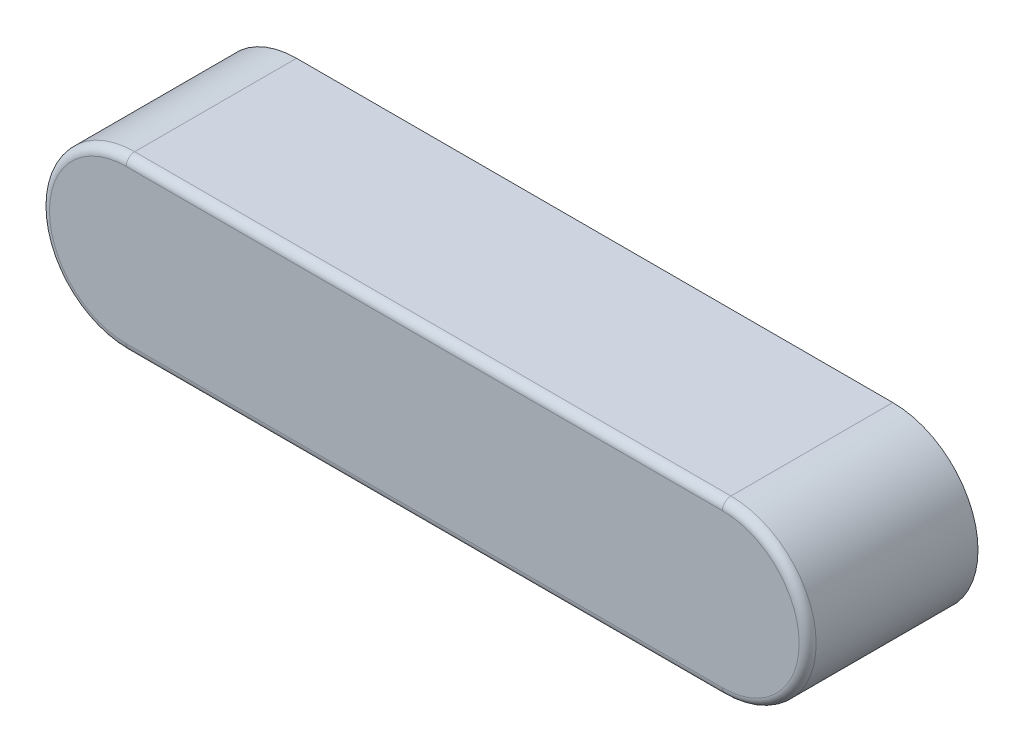
ISO-10303-21;
HEADER;
FILE_DESCRIPTION(('STEP AP214'),'2;1');
FILE_NAME('part.step','',(''),(''),'','','');
FILE_SCHEMA(('AUTOMOTIVE_DESIGN { 1 0 10303 214 1 1 1 1 }'));
ENDSEC;
DATA;
#1=APPLICATION_CONTEXT('core data for automotive mechanical design processes');
#2=APPLICATION_PROTOCOL_DEFINITION('international standard','automotive_design',2000,#1);
#3=PRODUCT_CONTEXT('',#1,'mechanical');
#4=PRODUCT('Part','Part','',(#3));
#5=PRODUCT_RELATED_PRODUCT_CATEGORY('part','',(#4));
#6=PRODUCT_DEFINITION_FORMATION('','',#4);
#7=PRODUCT_DEFINITION_CONTEXT('part definition',#1,'design');
#8=PRODUCT_DEFINITION('design','',#6,#7);
#9=PRODUCT_DEFINITION_SHAPE('','',#8);
#10=(LENGTH_UNIT() NAMED_UNIT(*) SI_UNIT(.MILLI.,.METRE.));
#11=(NAMED_UNIT(*) PLANE_ANGLE_UNIT() SI_UNIT($,.RADIAN.));
#12=(NAMED_UNIT(*) SI_UNIT($,.STERADIAN.) SOLID_ANGLE_UNIT());
#13=UNCERTAINTY_MEASURE_WITH_UNIT(LENGTH_MEASURE(1.E-05),#10,'distance_accuracy_value','');
#14=(GEOMETRIC_REPRESENTATION_CONTEXT(3) GLOBAL_UNCERTAINTY_ASSIGNED_CONTEXT((#13)) GLOBAL_UNIT_ASSIGNED_CONTEXT((#10,
#11,#12)) REPRESENTATION_CONTEXT('',''));
#15=CARTESIAN_POINT('',(0.,0.,0.));
#16=DIRECTION('',(0.,0.,1.));
#17=DIRECTION('',(1.,0.,0.));
#18=AXIS2_PLACEMENT_3D('',#15,#16,#17);
#19=CARTESIAN_POINT('',(-4.81757877280265,1.29059008723816,2.));
#20=DIRECTION('',(0.,0.,-1.));
#21=DIRECTION('',(-1.,0.,0.));
#22=AXIS2_PLACEMENT_3D('',#19,#20,#21);
#23=CYLINDRICAL_SURFACE('',#22,1.);
#24=DIRECTION('',(0.,0.,-1.));
#25=VECTOR('',#24,1.);
#26=CARTESIAN_POINT('',(-4.81757877280265,0.290590087238164,2.));
#27=LINE('',#26,#25);
#28=CARTESIAN_POINT('',(-4.81757877280265,0.290590087238164,1.9));
#29=VERTEX_POINT('',#28);
#30=CARTESIAN_POINT('',(-4.81757877280265,0.290590087238164,0.));
#31=VERTEX_POINT('',#30);
#32=EDGE_CURVE('E95',#29,#31,#27,.T.);
#33=ORIENTED_EDGE('',*,*,#32,.F.);
#34=CARTESIAN_POINT('',(-4.81757877280265,1.29059008723816,1.9));
#35=DIRECTION('',(0.,0.,1.));
#36=DIRECTION('',(1.,0.,0.));
#37=AXIS2_PLACEMENT_3D('',#34,#35,#36);
#38=CIRCLE('',#37,1.);
#39=CARTESIAN_POINT('',(-4.81757877280265,2.29059008723816,1.9));
#40=VERTEX_POINT('',#39);
#41=EDGE_CURVE('E11',#29,#40,#38,.F.);
#42=ORIENTED_EDGE('',*,*,#41,.T.);
#43=DIRECTION('',(0.,0.,-1.));
#44=VECTOR('',#43,1.);
#45=CARTESIAN_POINT('',(-4.81757877280265,2.29059008723816,2.));
#46=LINE('',#45,#44);
#47=CARTESIAN_POINT('',(-4.81757877280265,2.29059008723816,0.));
#48=VERTEX_POINT('',#47);
#49=EDGE_CURVE('E117',#40,#48,#46,.T.);
#50=ORIENTED_EDGE('',*,*,#49,.T.);
#51=CARTESIAN_POINT('',(-4.81757877280265,1.29059008723816,0.));
#52=DIRECTION('',(0.,0.,1.));
#53=DIRECTION('',(1.,0.,0.));
#54=AXIS2_PLACEMENT_3D('',#51,#52,#53);
#55=CIRCLE('',#54,1.);
#56=EDGE_CURVE('E111',#48,#31,#55,.T.);
#57=ORIENTED_EDGE('',*,*,#56,.T.);
#58=EDGE_LOOP('',(#33,#42,#50,#57));
#59=FACE_BOUND('',#58,.T.);
#60=ADVANCED_FACE('F42',(#59),#23,.T.);
#61=CARTESIAN_POINT('',(-4.81757877280265,0.290590087238164,2.));
#62=DIRECTION('',(0.,1.,0.));
#63=DIRECTION('',(0.,0.,1.));
#64=AXIS2_PLACEMENT_3D('',#61,#62,#63);
#65=PLANE('',#64);
#66=DIRECTION('',(0.,0.,-1.));
#67=VECTOR('',#66,1.);
#68=CARTESIAN_POINT('',(2.18242122719735,0.290590087238164,2.));
#69=LINE('',#68,#67);
#70=CARTESIAN_POINT('',(2.18242122719735,0.290590087238164,1.9));
#71=VERTEX_POINT('',#70);
#72=CARTESIAN_POINT('',(2.18242122719735,0.290590087238164,0.));
#73=VERTEX_POINT('',#72);
#74=EDGE_CURVE('E105',#71,#73,#69,.T.);
#75=ORIENTED_EDGE('',*,*,#74,.F.);
#76=DIRECTION('',(1.,0.,0.));
#77=VECTOR('',#76,1.);
#78=CARTESIAN_POINT('',(-4.81757877280265,0.290590087238164,1.9));
#79=LINE('',#78,#77);
#80=EDGE_CURVE('E52',#71,#29,#79,.F.);
#81=ORIENTED_EDGE('',*,*,#80,.T.);
#82=ORIENTED_EDGE('',*,*,#32,.T.);
#83=DIRECTION('',(1.,0.,0.));
#84=VECTOR('',#83,1.);
#85=CARTESIAN_POINT('',(-4.81757877280265,0.290590087238164,0.));
#86=LINE('',#85,#84);
#87=EDGE_CURVE('E98',#31,#73,#86,.T.);
#88=ORIENTED_EDGE('',*,*,#87,.T.);
#89=EDGE_LOOP('',(#75,#81,#82,#88));
#90=FACE_BOUND('',#89,.T.);
#91=ADVANCED_FACE('F97',(#90),#65,.F.);
#92=CARTESIAN_POINT('',(2.18242122719735,1.29059008723816,2.));
#93=DIRECTION('',(0.,0.,-1.));
#94=DIRECTION('',(-1.,0.,0.));
#95=AXIS2_PLACEMENT_3D('',#92,#93,#94);
#96=CYLINDRICAL_SURFACE('',#95,1.);
#97=DIRECTION('',(0.,0.,-1.));
#98=VECTOR('',#97,1.);
#99=CARTESIAN_POINT('',(2.18242122719735,2.29059008723816,2.));
#100=LINE('',#99,#98);
#101=CARTESIAN_POINT('',(2.18242122719735,2.29059008723816,1.9));
#102=VERTEX_POINT('',#101);
#103=CARTESIAN_POINT('',(2.18242122719735,2.29059008723816,0.));
#104=VERTEX_POINT('',#103);
#105=EDGE_CURVE('E132',#102,#104,#100,.T.);
#106=ORIENTED_EDGE('',*,*,#105,.F.);
#107=CARTESIAN_POINT('',(2.18242122719735,1.29059008723816,1.9));
#108=DIRECTION('',(0.,0.,1.));
#109=DIRECTION('',(1.,0.,0.));
#110=AXIS2_PLACEMENT_3D('',#107,#108,#109);
#111=CIRCLE('',#110,1.);
#112=EDGE_CURVE('E67',#102,#71,#111,.F.);
#113=ORIENTED_EDGE('',*,*,#112,.T.);
#114=ORIENTED_EDGE('',*,*,#74,.T.);
#115=CARTESIAN_POINT('',(2.18242122719735,1.29059008723816,0.));
#116=DIRECTION('',(0.,0.,1.));
#117=DIRECTION('',(1.,0.,0.));
#118=AXIS2_PLACEMENT_3D('',#115,#116,#117);
#119=CIRCLE('',#118,1.);
#120=EDGE_CURVE('E113',#73,#104,#119,.T.);
#121=ORIENTED_EDGE('',*,*,#120,.T.);
#122=EDGE_LOOP('',(#106,#113,#114,#121));
#123=FACE_BOUND('',#122,.T.);
#124=ADVANCED_FACE('F182',(#123),#96,.T.);
#125=CARTESIAN_POINT('',(-4.81757877280265,2.29059008723816,2.));
#126=DIRECTION('',(0.,-1.,0.));
#127=DIRECTION('',(0.,0.,-1.));
#128=AXIS2_PLACEMENT_3D('',#125,#126,#127);
#129=PLANE('',#128);
#130=ORIENTED_EDGE('',*,*,#49,.F.);
#131=DIRECTION('',(-1.,0.,0.));
#132=VECTOR('',#131,1.);
#133=CARTESIAN_POINT('',(2.18242122719735,2.29059008723816,1.9));
#134=LINE('',#133,#132);
#135=EDGE_CURVE('E149',#40,#102,#134,.F.);
#136=ORIENTED_EDGE('',*,*,#135,.T.);
#137=ORIENTED_EDGE('',*,*,#105,.T.);
#138=DIRECTION('',(-1.,0.,0.));
#139=VECTOR('',#138,1.);
#140=CARTESIAN_POINT('',(-4.81757877280265,2.29059008723816,0.));
#141=LINE('',#140,#139);
#142=EDGE_CURVE('E127',#104,#48,#141,.T.);
#143=ORIENTED_EDGE('',*,*,#142,.T.);
#144=EDGE_LOOP('',(#130,#136,#137,#143));
#145=FACE_BOUND('',#144,.T.);
#146=ADVANCED_FACE('F181',(#145),#129,.F.);
#147=CARTESIAN_POINT('',(-4.81757877280265,1.29059008723816,2.));
#148=DIRECTION('',(0.,0.,1.));
#149=DIRECTION('',(1.,0.,0.));
#150=AXIS2_PLACEMENT_3D('',#147,#148,#149);
#151=PLANE('',#150);
#152=CARTESIAN_POINT('',(2.18242122719735,1.29059008723816,2.));
#153=DIRECTION('',(0.,0.,1.));
#154=DIRECTION('',(1.,0.,0.));
#155=AXIS2_PLACEMENT_3D('',#152,#153,#154);
#156=CIRCLE('',#155,0.9);
#157=CARTESIAN_POINT('',(2.18242122719735,0.390590087238164,2.));
#158=VERTEX_POINT('',#157);
#159=CARTESIAN_POINT('',(2.18242122719735,2.19059008723816,2.));
#160=VERTEX_POINT('',#159);
#161=EDGE_CURVE('E142',#158,#160,#156,.T.);
#162=ORIENTED_EDGE('',*,*,#161,.T.);
#163=DIRECTION('',(-1.,0.,0.));
#164=VECTOR('',#163,1.);
#165=CARTESIAN_POINT('',(-4.81757877280265,2.19059008723816,2.));
#166=LINE('',#165,#164);
#167=CARTESIAN_POINT('',(-4.81757877280265,2.19059008723816,2.));
#168=VERTEX_POINT('',#167);
#169=EDGE_CURVE('E145',#160,#168,#166,.T.);
#170=ORIENTED_EDGE('',*,*,#169,.T.);
#171=CARTESIAN_POINT('',(-4.81757877280265,1.29059008723816,2.));
#172=DIRECTION('',(0.,0.,1.));
#173=DIRECTION('',(1.,0.,0.));
#174=AXIS2_PLACEMENT_3D('',#171,#172,#173);
#175=CIRCLE('',#174,0.9);
#176=CARTESIAN_POINT('',(-4.81757877280265,0.390590087238164,2.));
#177=VERTEX_POINT('',#176);
#178=EDGE_CURVE('E104',#168,#177,#175,.T.);
#179=ORIENTED_EDGE('',*,*,#178,.T.);
#180=DIRECTION('',(1.,0.,0.));
#181=VECTOR('',#180,1.);
#182=CARTESIAN_POINT('',(2.18242122719735,0.390590087238164,2.));
#183=LINE('',#182,#181);
#184=EDGE_CURVE('E139',#177,#158,#183,.T.);
#185=ORIENTED_EDGE('',*,*,#184,.T.);
#186=EDGE_LOOP('',(#162,#170,#179,#185));
#187=FACE_BOUND('',#186,.T.);
#188=ADVANCED_FACE('F174',(#187),#151,.T.);
#189=CARTESIAN_POINT('',(-4.81757877280265,1.29059008723816,0.));
#190=DIRECTION('',(0.,0.,1.));
#191=DIRECTION('',(1.,0.,0.));
#192=AXIS2_PLACEMENT_3D('',#189,#190,#191);
#193=PLANE('',#192);
#194=ORIENTED_EDGE('',*,*,#56,.F.);
#195=ORIENTED_EDGE('',*,*,#142,.F.);
#196=ORIENTED_EDGE('',*,*,#120,.F.);
#197=ORIENTED_EDGE('',*,*,#87,.F.);
#198=EDGE_LOOP('',(#194,#195,#196,#197));
#199=FACE_BOUND('',#198,.T.);
#200=ADVANCED_FACE('F109',(#199),#193,.F.);
#201=CARTESIAN_POINT('',(-4.81757877280265,0.390590087238164,1.9));
#202=DIRECTION('',(-1.,0.,0.));
#203=DIRECTION('',(0.,0.,1.));
#204=AXIS2_PLACEMENT_3D('',#201,#202,#203);
#205=CYLINDRICAL_SURFACE('',#204,0.1);
#206=CARTESIAN_POINT('',(-4.81757877280265,0.390590087238164,1.9));
#207=DIRECTION('',(-1.,0.,0.));
#208=DIRECTION('',(0.,0.,1.));
#209=AXIS2_PLACEMENT_3D('',#206,#207,#208);
#210=CIRCLE('',#209,0.1);
#211=EDGE_CURVE('E123',#29,#177,#210,.T.);
#212=ORIENTED_EDGE('',*,*,#211,.F.);
#213=ORIENTED_EDGE('',*,*,#80,.F.);
#214=CARTESIAN_POINT('',(2.18242122719735,0.390590087238164,1.9));
#215=DIRECTION('',(1.,0.,0.));
#216=DIRECTION('',(0.,0.,-1.));
#217=AXIS2_PLACEMENT_3D('',#214,#215,#216);
#218=CIRCLE('',#217,0.1);
#219=EDGE_CURVE('E46',#158,#71,#218,.T.);
#220=ORIENTED_EDGE('',*,*,#219,.F.);
#221=ORIENTED_EDGE('',*,*,#184,.F.);
#222=EDGE_LOOP('',(#212,#213,#220,#221));
#223=FACE_BOUND('',#222,.T.);
#224=ADVANCED_FACE('F44',(#223),#205,.T.);
#225=CARTESIAN_POINT('',(2.18242122719735,1.29059008723816,1.9));
#226=DIRECTION('',(0.,0.,1.));
#227=DIRECTION('',(1.,0.,0.));
#228=AXIS2_PLACEMENT_3D('',#225,#226,#227);
#229=TOROIDAL_SURFACE('',#228,0.9,0.1);
#230=ORIENTED_EDGE('',*,*,#219,.T.);
#231=ORIENTED_EDGE('',*,*,#112,.F.);
#232=CARTESIAN_POINT('',(2.18242122719735,2.19059008723816,1.9));
#233=DIRECTION('',(-1.,0.,0.));
#234=DIRECTION('',(0.,0.,1.));
#235=AXIS2_PLACEMENT_3D('',#232,#233,#234);
#236=CIRCLE('',#235,0.1);
#237=EDGE_CURVE('E160',#160,#102,#236,.T.);
#238=ORIENTED_EDGE('',*,*,#237,.F.);
#239=ORIENTED_EDGE('',*,*,#161,.F.);
#240=EDGE_LOOP('',(#230,#231,#238,#239));
#241=FACE_BOUND('',#240,.T.);
#242=ADVANCED_FACE('F199',(#241),#229,.T.);
#243=CARTESIAN_POINT('',(-4.81757877280265,1.29059008723816,1.9));
#244=DIRECTION('',(0.,0.,1.));
#245=DIRECTION('',(1.,0.,0.));
#246=AXIS2_PLACEMENT_3D('',#243,#244,#245);
#247=TOROIDAL_SURFACE('',#246,0.9,0.1);
#248=ORIENTED_EDGE('',*,*,#211,.T.);
#249=ORIENTED_EDGE('',*,*,#178,.F.);
#250=CARTESIAN_POINT('',(-4.81757877280265,2.19059008723816,1.9));
#251=DIRECTION('',(1.,0.,0.));
#252=DIRECTION('',(0.,0.,-1.));
#253=AXIS2_PLACEMENT_3D('',#250,#251,#252);
#254=CIRCLE('',#253,0.1);
#255=EDGE_CURVE('E157',#40,#168,#254,.T.);
#256=ORIENTED_EDGE('',*,*,#255,.F.);
#257=ORIENTED_EDGE('',*,*,#41,.F.);
#258=EDGE_LOOP('',(#248,#249,#256,#257));
#259=FACE_BOUND('',#258,.T.);
#260=ADVANCED_FACE('F167',(#259),#247,.T.);
#261=CARTESIAN_POINT('',(-4.81757877280265,2.19059008723816,1.9));
#262=DIRECTION('',(1.,0.,0.));
#263=DIRECTION('',(0.,0.,-1.));
#264=AXIS2_PLACEMENT_3D('',#261,#262,#263);
#265=CYLINDRICAL_SURFACE('',#264,0.1);
#266=ORIENTED_EDGE('',*,*,#237,.T.);
#267=ORIENTED_EDGE('',*,*,#135,.F.);
#268=ORIENTED_EDGE('',*,*,#255,.T.);
#269=ORIENTED_EDGE('',*,*,#169,.F.);
#270=EDGE_LOOP('',(#266,#267,#268,#269));
#271=FACE_BOUND('',#270,.T.);
#272=ADVANCED_FACE('F178',(#271),#265,.T.);
#273=CLOSED_SHELL('',(#60,#91,#124,#146,#188,#200,#224,#242,#260,#272));
#274=MANIFOLD_SOLID_BREP('B2',#273);
#275=ADVANCED_BREP_SHAPE_REPRESENTATION('',(#18,#274),#14);
#276=SHAPE_DEFINITION_REPRESENTATION(#9,#275);
ENDSEC;
END-ISO-10303-21;
